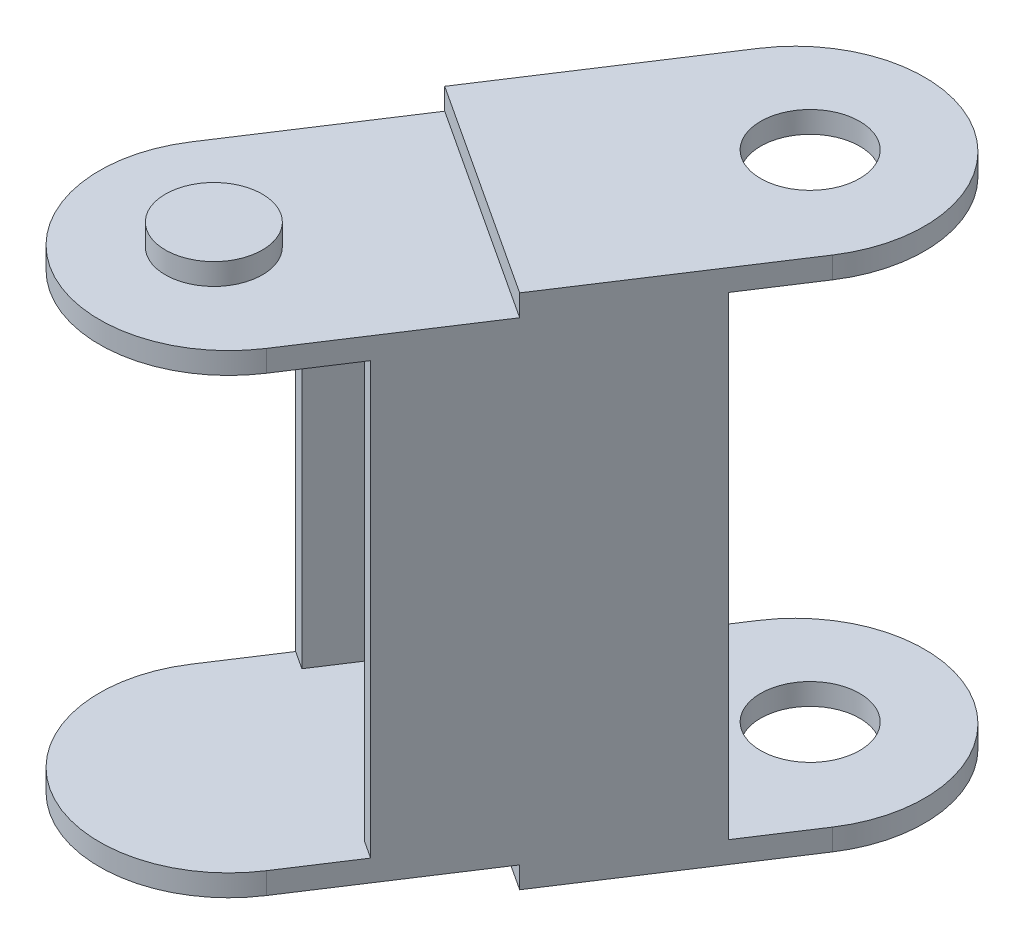
ISO-10303-21;
HEADER;
FILE_DESCRIPTION(('STEP AP214'),'2;1');
FILE_NAME('part.step','',(''),(''),'','','');
FILE_SCHEMA(('AUTOMOTIVE_DESIGN { 1 0 10303 214 1 1 1 1 }'));
ENDSEC;
DATA;
#1=APPLICATION_CONTEXT('core data for automotive mechanical design processes');
#2=APPLICATION_PROTOCOL_DEFINITION('international standard','automotive_design',2000,#1);
#3=PRODUCT_CONTEXT('',#1,'mechanical');
#4=PRODUCT('Part','Part','',(#3));
#5=PRODUCT_RELATED_PRODUCT_CATEGORY('part','',(#4));
#6=PRODUCT_DEFINITION_FORMATION('','',#4);
#7=PRODUCT_DEFINITION_CONTEXT('part definition',#1,'design');
#8=PRODUCT_DEFINITION('design','',#6,#7);
#9=PRODUCT_DEFINITION_SHAPE('','',#8);
#10=(LENGTH_UNIT() NAMED_UNIT(*) SI_UNIT(.MILLI.,.METRE.));
#11=(NAMED_UNIT(*) PLANE_ANGLE_UNIT() SI_UNIT($,.RADIAN.));
#12=(NAMED_UNIT(*) SI_UNIT($,.STERADIAN.) SOLID_ANGLE_UNIT());
#13=UNCERTAINTY_MEASURE_WITH_UNIT(LENGTH_MEASURE(1.E-05),#10,'distance_accuracy_value','');
#14=(GEOMETRIC_REPRESENTATION_CONTEXT(3) GLOBAL_UNCERTAINTY_ASSIGNED_CONTEXT((#13)) GLOBAL_UNIT_ASSIGNED_CONTEXT((#10,
#11,#12)) REPRESENTATION_CONTEXT('',''));
#15=CARTESIAN_POINT('',(0.,0.,0.));
#16=DIRECTION('',(0.,0.,1.));
#17=DIRECTION('',(1.,0.,0.));
#18=AXIS2_PLACEMENT_3D('',#15,#16,#17);
#19=CARTESIAN_POINT('',(-568.4078515014,21.5,26.4838286484));
#20=DIRECTION('',(0.,1.,0.));
#21=DIRECTION('',(-0.547036832011637,0.,0.837108538018023));
#22=AXIS2_PLACEMENT_3D('',#19,#20,#21);
#23=CYLINDRICAL_SURFACE('',#22,2.25);
#24=CARTESIAN_POINT('',(-568.4078515014,21.,26.4838286484));
#25=DIRECTION('',(0.,1.,0.));
#26=DIRECTION('',(-0.547036832011599,0.,0.837108538018048));
#27=AXIS2_PLACEMENT_3D('',#24,#25,#26);
#28=CIRCLE('',#27,2.25);
#29=CARTESIAN_POINT('',(-569.638684373426,21.,28.3673228589406));
#30=VERTEX_POINT('',#29);
#31=EDGE_CURVE('E205',#30,#30,#28,.F.);
#32=ORIENTED_EDGE('',*,*,#31,.F.);
#33=EDGE_LOOP('',(#32));
#34=FACE_BOUND('',#33,.T.);
#35=CARTESIAN_POINT('',(-568.4078515014,22.,26.4838286484));
#36=DIRECTION('',(0.,-1.,0.));
#37=DIRECTION('',(0.54703683201165,0.,-0.837108538018015));
#38=AXIS2_PLACEMENT_3D('',#35,#36,#37);
#39=CIRCLE('',#38,2.25);
#40=CARTESIAN_POINT('',(-567.177018629374,22.,24.6003344378595));
#41=VERTEX_POINT('',#40);
#42=EDGE_CURVE('E202',#41,#41,#39,.F.);
#43=ORIENTED_EDGE('',*,*,#42,.F.);
#44=EDGE_LOOP('',(#43));
#45=FACE_BOUND('',#44,.T.);
#46=ADVANCED_FACE('F17',(#34,#45),#23,.T.);
#47=CARTESIAN_POINT('',(-558.461868785464,21.,22.23207279855));
#48=DIRECTION('',(0.,1.,0.));
#49=DIRECTION('',(-0.837108538017957,0.,-0.547036832011738));
#50=AXIS2_PLACEMENT_3D('',#47,#48,#49);
#51=PLANE('',#50);
#52=CARTESIAN_POINT('',(-568.134333085423,21.,26.065274379253));
#53=DIRECTION('',(0.,1.,0.));
#54=DIRECTION('',(-0.547036831997825,0.,0.837108538027049));
#55=AXIS2_PLACEMENT_3D('',#52,#53,#54);
#56=CIRCLE('',#55,6.);
#57=CARTESIAN_POINT('',(-563.111681857329,21.,29.347495371344));
#58=VERTEX_POINT('',#57);
#59=CARTESIAN_POINT('',(-573.156984313483,21.,22.783053387219));
#60=VERTEX_POINT('',#59);
#61=EDGE_CURVE('E189',#58,#60,#56,.F.);
#62=ORIENTED_EDGE('',*,*,#61,.F.);
#63=DIRECTION('',(0.547036832013872,0.,-0.837108538016563));
#64=VECTOR('',#63,1.);
#65=CARTESIAN_POINT('',(-563.111681857365,21.,29.347495371321));
#66=LINE('',#65,#64);
#67=CARTESIAN_POINT('',(-558.461868785481,21.,22.232072798539));
#68=VERTEX_POINT('',#67);
#69=EDGE_CURVE('E177',#68,#58,#66,.F.);
#70=ORIENTED_EDGE('',*,*,#69,.F.);
#71=DIRECTION('',(-0.83710853801795,0.,-0.547036832011749));
#72=VECTOR('',#71,1.);
#73=CARTESIAN_POINT('',(-558.461868785481,21.,22.232072798539));
#74=LINE('',#73,#72);
#75=CARTESIAN_POINT('',(-568.507171242,21.,15.6676308142));
#76=VERTEX_POINT('',#75);
#77=EDGE_CURVE('E188',#76,#68,#74,.F.);
#78=ORIENTED_EDGE('',*,*,#77,.F.);
#79=DIRECTION('',(-0.547036831968092,0.,0.837108538046479));
#80=VECTOR('',#79,1.);
#81=CARTESIAN_POINT('',(-568.507171242,21.,15.6676308142));
#82=LINE('',#81,#80);
#83=EDGE_CURVE('E201',#60,#76,#82,.F.);
#84=ORIENTED_EDGE('',*,*,#83,.F.);
#85=EDGE_LOOP('',(#62,#70,#78,#84));
#86=FACE_BOUND('',#85,.T.);
#87=ORIENTED_EDGE('',*,*,#31,.T.);
#88=EDGE_LOOP('',(#87));
#89=FACE_BOUND('',#88,.T.);
#90=ADVANCED_FACE('F199',(#86,#89),#51,.T.);
#91=CARTESIAN_POINT('',(-569.110907137406,22.,23.336569711002));
#92=DIRECTION('',(0.,1.,0.));
#93=DIRECTION('',(-0.547036832011739,0.,0.837108538017957));
#94=AXIS2_PLACEMENT_3D('',#91,#92,#93);
#95=PLANE('',#94);
#96=ORIENTED_EDGE('',*,*,#42,.T.);
#97=EDGE_LOOP('',(#96));
#98=FACE_BOUND('',#97,.T.);
#99=ADVANCED_FACE('F629',(#98),#95,.T.);
#100=CARTESIAN_POINT('',(-568.134333085256,-2.,26.065274379362));
#101=DIRECTION('',(0.,1.,0.));
#102=DIRECTION('',(-0.837108538018314,0.,-0.547036832011192));
#103=AXIS2_PLACEMENT_3D('',#100,#101,#102);
#104=CYLINDRICAL_SURFACE('',#103,6.);
#105=DIRECTION('',(-1.1482E-11,-1.,1.7653E-11));
#106=VECTOR('',#105,1.);
#107=CARTESIAN_POINT('',(-573.156984313366,21.,22.783053387295));
#108=LINE('',#107,#106);
#109=CARTESIAN_POINT('',(-573.156984313377,20.,22.783053387312));
#110=VERTEX_POINT('',#109);
#111=EDGE_CURVE('E217',#110,#60,#108,.F.);
#112=ORIENTED_EDGE('',*,*,#111,.F.);
#113=CARTESIAN_POINT('',(-568.134333085256,20.,26.065274379362));
#114=DIRECTION('',(0.,1.,0.));
#115=DIRECTION('',(-0.837108538020234,0.,-0.547036832008254));
#116=AXIS2_PLACEMENT_3D('',#113,#114,#115);
#117=CIRCLE('',#116,6.);
#118=CARTESIAN_POINT('',(-563.11168185732,20.,29.347495371331));
#119=VERTEX_POINT('',#118);
#120=EDGE_CURVE('E196',#110,#119,#117,.T.);
#121=ORIENTED_EDGE('',*,*,#120,.T.);
#122=DIRECTION('',(-8.754E-12,1.,1.3255E-11));
#123=VECTOR('',#122,1.);
#124=CARTESIAN_POINT('',(-563.11168185732,20.,29.347495371331));
#125=LINE('',#124,#123);
#126=EDGE_CURVE('E181',#119,#58,#125,.T.);
#127=ORIENTED_EDGE('',*,*,#126,.T.);
#128=ORIENTED_EDGE('',*,*,#61,.T.);
#129=EDGE_LOOP('',(#112,#121,#127,#128));
#130=FACE_BOUND('',#129,.T.);
#131=ADVANCED_FACE('F195',(#130),#104,.T.);
#132=CARTESIAN_POINT('',(-563.111681857287,-2.,29.347495371461));
#133=DIRECTION('',(0.837108538017957,0.,0.547036832011739));
#134=DIRECTION('',(0.547036832011739,0.,-0.837108538017957));
#135=AXIS2_PLACEMENT_3D('',#132,#133,#134);
#136=PLANE('',#135);
#137=DIRECTION('',(0.,-1.,0.));
#138=VECTOR('',#137,1.);
#139=CARTESIAN_POINT('',(-558.46186878538,22.,22.232072798605));
#140=LINE('',#139,#138);
#141=CARTESIAN_POINT('',(-558.46186878538,22.,22.232072798605));
#142=VERTEX_POINT('',#141);
#143=EDGE_CURVE('E184',#142,#68,#140,.T.);
#144=ORIENTED_EDGE('',*,*,#143,.T.);
#145=ORIENTED_EDGE('',*,*,#69,.T.);
#146=ORIENTED_EDGE('',*,*,#126,.F.);
#147=DIRECTION('',(0.547036832011751,0.,-0.837108538017949));
#148=VECTOR('',#147,1.);
#149=CARTESIAN_POINT('',(-563.111681857237,20.,29.347495371385));
#150=LINE('',#149,#148);
#151=CARTESIAN_POINT('',(-561.197052945412,20.,26.417615488653));
#152=VERTEX_POINT('',#151);
#153=EDGE_CURVE('E229',#119,#152,#150,.T.);
#154=ORIENTED_EDGE('',*,*,#153,.T.);
#155=DIRECTION('',(0.,-1.,0.));
#156=VECTOR('',#155,1.);
#157=CARTESIAN_POINT('',(-561.197052945412,20.,26.417615488653));
#158=LINE('',#157,#156);
#159=CARTESIAN_POINT('',(-561.197052945412,0.,26.417615488653));
#160=VERTEX_POINT('',#159);
#161=EDGE_CURVE('E233',#152,#160,#158,.T.);
#162=ORIENTED_EDGE('',*,*,#161,.T.);
#163=DIRECTION('',(-0.547036832011735,0.,0.837108538017959));
#164=VECTOR('',#163,1.);
#165=CARTESIAN_POINT('',(-561.197052945412,0.,26.417615488653));
#166=LINE('',#165,#164);
#167=CARTESIAN_POINT('',(-563.111681857245,0.,29.347495371399));
#168=VERTEX_POINT('',#167);
#169=EDGE_CURVE('E238',#160,#168,#166,.T.);
#170=ORIENTED_EDGE('',*,*,#169,.T.);
#171=DIRECTION('',(-2.387E-12,-1.,3.67E-12));
#172=VECTOR('',#171,1.);
#173=CARTESIAN_POINT('',(-563.111681857245,0.,29.347495371399));
#174=LINE('',#173,#172);
#175=CARTESIAN_POINT('',(-563.111681857248,-1.,29.347495371402));
#176=VERTEX_POINT('',#175);
#177=EDGE_CURVE('E243',#176,#168,#174,.F.);
#178=ORIENTED_EDGE('',*,*,#177,.F.);
#179=DIRECTION('',(0.547036832011736,0.,-0.837108538017958));
#180=VECTOR('',#179,1.);
#181=CARTESIAN_POINT('',(-563.111681857248,-1.,29.347495371402));
#182=LINE('',#181,#180);
#183=CARTESIAN_POINT('',(-558.46186878538,-1.,22.232072798605));
#184=VERTEX_POINT('',#183);
#185=EDGE_CURVE('E247',#176,#184,#182,.T.);
#186=ORIENTED_EDGE('',*,*,#185,.T.);
#187=DIRECTION('',(0.,-1.,0.));
#188=VECTOR('',#187,1.);
#189=CARTESIAN_POINT('',(-558.46186878538,-1.,22.232072798605));
#190=LINE('',#189,#188);
#191=CARTESIAN_POINT('',(-558.46186878538,-2.,22.232072798605));
#192=VERTEX_POINT('',#191);
#193=EDGE_CURVE('E252',#184,#192,#190,.T.);
#194=ORIENTED_EDGE('',*,*,#193,.T.);
#195=DIRECTION('',(0.547036832011742,0.,-0.837108538017955));
#196=VECTOR('',#195,1.);
#197=CARTESIAN_POINT('',(-558.46186878538,-2.,22.232072798605));
#198=LINE('',#197,#196);
#199=CARTESIAN_POINT('',(-552.717982049063,-2.,13.44243314912));
#200=VERTEX_POINT('',#199);
#201=EDGE_CURVE('E257',#192,#200,#198,.T.);
#202=ORIENTED_EDGE('',*,*,#201,.T.);
#203=DIRECTION('',(-1.14E-13,1.,1.15E-13));
#204=VECTOR('',#203,1.);
#205=CARTESIAN_POINT('',(-552.717982049063,-2.,13.44243314912));
#206=LINE('',#205,#204);
#207=CARTESIAN_POINT('',(-552.717982049063,-1.,13.44243314912));
#208=VERTEX_POINT('',#207);
#209=EDGE_CURVE('E262',#200,#208,#206,.T.);
#210=ORIENTED_EDGE('',*,*,#209,.T.);
#211=DIRECTION('',(-0.547036832011731,0.,0.837108538017962));
#212=VECTOR('',#211,1.);
#213=CARTESIAN_POINT('',(-552.717982049063,-1.,13.44243314912));
#214=LINE('',#213,#212);
#215=CARTESIAN_POINT('',(-554.632610961263,-1.,16.372313032426));
#216=VERTEX_POINT('',#215);
#217=EDGE_CURVE('E267',#208,#216,#214,.T.);
#218=ORIENTED_EDGE('',*,*,#217,.T.);
#219=DIRECTION('',(0.,1.,0.));
#220=VECTOR('',#219,1.);
#221=CARTESIAN_POINT('',(-554.632610961263,-1.,16.372313032426));
#222=LINE('',#221,#220);
#223=CARTESIAN_POINT('',(-554.632610961263,21.,16.372313032426));
#224=VERTEX_POINT('',#223);
#225=EDGE_CURVE('E272',#216,#224,#222,.T.);
#226=ORIENTED_EDGE('',*,*,#225,.T.);
#227=DIRECTION('',(0.54703683201175,0.,-0.83710853801795));
#228=VECTOR('',#227,1.);
#229=CARTESIAN_POINT('',(-554.632610961263,21.,16.372313032426));
#230=LINE('',#229,#228);
#231=CARTESIAN_POINT('',(-552.717982049063,21.,13.44243314912));
#232=VERTEX_POINT('',#231);
#233=EDGE_CURVE('E277',#224,#232,#230,.T.);
#234=ORIENTED_EDGE('',*,*,#233,.T.);
#235=DIRECTION('',(0.,1.,0.));
#236=VECTOR('',#235,1.);
#237=CARTESIAN_POINT('',(-552.717982049063,21.,13.44243314912));
#238=LINE('',#237,#236);
#239=CARTESIAN_POINT('',(-552.717982049063,22.,13.44243314912));
#240=VERTEX_POINT('',#239);
#241=EDGE_CURVE('E282',#232,#240,#238,.T.);
#242=ORIENTED_EDGE('',*,*,#241,.T.);
#243=DIRECTION('',(-0.547036832011743,0.,0.837108538017954));
#244=VECTOR('',#243,1.);
#245=CARTESIAN_POINT('',(-552.717982049063,22.,13.44243314912));
#246=LINE('',#245,#244);
#247=EDGE_CURVE('E287',#240,#142,#246,.T.);
#248=ORIENTED_EDGE('',*,*,#247,.T.);
#249=EDGE_LOOP('',(#144,#145,#146,#154,#162,#170,#178,#186,#194,#202,#210,#218,#226,#234,#242,#248));
#250=FACE_BOUND('',#249,.T.);
#251=ADVANCED_FACE('F179',(#250),#136,.T.);
#252=CARTESIAN_POINT('',(-568.507171242,21.,15.6676308142));
#253=DIRECTION('',(-0.547036832011738,0.,0.837108538017957));
#254=DIRECTION('',(0.837108538017957,0.,0.547036832011738));
#255=AXIS2_PLACEMENT_3D('',#252,#253,#254);
#256=PLANE('',#255);
#257=DIRECTION('',(-0.837108538017957,0.,-0.547036832011739));
#258=VECTOR('',#257,1.);
#259=CARTESIAN_POINT('',(-558.461868785481,22.,22.232072798539));
#260=LINE('',#259,#258);
#261=CARTESIAN_POINT('',(-568.507171241922,22.,15.667630814251));
#262=VERTEX_POINT('',#261);
#263=EDGE_CURVE('E291',#262,#142,#260,.F.);
#264=ORIENTED_EDGE('',*,*,#263,.F.);
#265=DIRECTION('',(-7.8444E-11,-1.,-5.1275E-11));
#266=VECTOR('',#265,1.);
#267=CARTESIAN_POINT('',(-568.507171241922,22.,15.667630814251));
#268=LINE('',#267,#266);
#269=EDGE_CURVE('E295',#76,#262,#268,.F.);
#270=ORIENTED_EDGE('',*,*,#269,.F.);
#271=ORIENTED_EDGE('',*,*,#77,.T.);
#272=ORIENTED_EDGE('',*,*,#143,.F.);
#273=EDGE_LOOP('',(#264,#270,#271,#272));
#274=FACE_BOUND('',#273,.T.);
#275=ADVANCED_FACE('F613',(#274),#256,.T.);
#276=CARTESIAN_POINT('',(-562.763284505279,-2.,6.877991164979));
#277=DIRECTION('',(-0.837108538017957,0.,-0.547036832011739));
#278=DIRECTION('',(-0.547036832011739,0.,0.837108538017957));
#279=AXIS2_PLACEMENT_3D('',#276,#277,#278);
#280=PLANE('',#279);
#281=ORIENTED_EDGE('',*,*,#83,.T.);
#282=ORIENTED_EDGE('',*,*,#269,.T.);
#283=DIRECTION('',(0.547036832011739,0.,-0.837108538017956));
#284=VECTOR('',#283,1.);
#285=CARTESIAN_POINT('',(-568.507171241596,22.,15.667630814464));
#286=LINE('',#285,#284);
#287=CARTESIAN_POINT('',(-562.763284505279,22.,6.877991164979));
#288=VERTEX_POINT('',#287);
#289=EDGE_CURVE('E300',#262,#288,#286,.T.);
#290=ORIENTED_EDGE('',*,*,#289,.T.);
#291=DIRECTION('',(0.,-1.,0.));
#292=VECTOR('',#291,1.);
#293=CARTESIAN_POINT('',(-562.763284505279,22.,6.877991164979));
#294=LINE('',#293,#292);
#295=CARTESIAN_POINT('',(-562.763284505279,21.,6.87799116498));
#296=VERTEX_POINT('',#295);
#297=EDGE_CURVE('E305',#296,#288,#294,.F.);
#298=ORIENTED_EDGE('',*,*,#297,.F.);
#299=DIRECTION('',(-0.547036832011748,0.,0.837108538017951));
#300=VECTOR('',#299,1.);
#301=CARTESIAN_POINT('',(-562.763284505279,21.,6.87799116498));
#302=LINE('',#301,#300);
#303=CARTESIAN_POINT('',(-564.677913417478,21.,9.807871048285));
#304=VERTEX_POINT('',#303);
#305=EDGE_CURVE('E310',#296,#304,#302,.T.);
#306=ORIENTED_EDGE('',*,*,#305,.T.);
#307=DIRECTION('',(0.,-1.,0.));
#308=VECTOR('',#307,1.);
#309=CARTESIAN_POINT('',(-564.677913417478,21.,9.807871048285));
#310=LINE('',#309,#308);
#311=CARTESIAN_POINT('',(-564.677913417478,-1.,9.807871048285));
#312=VERTEX_POINT('',#311);
#313=EDGE_CURVE('E315',#304,#312,#310,.T.);
#314=ORIENTED_EDGE('',*,*,#313,.T.);
#315=DIRECTION('',(0.547036832011748,0.,-0.83710853801795));
#316=VECTOR('',#315,1.);
#317=CARTESIAN_POINT('',(-564.677913417478,-1.,9.807871048285));
#318=LINE('',#317,#316);
#319=CARTESIAN_POINT('',(-562.763284505279,-1.,6.877991164979));
#320=VERTEX_POINT('',#319);
#321=EDGE_CURVE('E320',#312,#320,#318,.T.);
#322=ORIENTED_EDGE('',*,*,#321,.T.);
#323=DIRECTION('',(0.,-1.,0.));
#324=VECTOR('',#323,1.);
#325=CARTESIAN_POINT('',(-562.763284505279,-1.,6.877991164979));
#326=LINE('',#325,#324);
#327=CARTESIAN_POINT('',(-562.763284505279,-2.,6.877991164979));
#328=VERTEX_POINT('',#327);
#329=EDGE_CURVE('E325',#328,#320,#326,.F.);
#330=ORIENTED_EDGE('',*,*,#329,.F.);
#331=DIRECTION('',(-0.547036832011738,0.,0.837108538017957));
#332=VECTOR('',#331,1.);
#333=CARTESIAN_POINT('',(-562.763284505279,-2.,6.877991164979));
#334=LINE('',#333,#332);
#335=CARTESIAN_POINT('',(-568.507171241596,-2.,15.667630814464));
#336=VERTEX_POINT('',#335);
#337=EDGE_CURVE('E330',#328,#336,#334,.T.);
#338=ORIENTED_EDGE('',*,*,#337,.T.);
#339=DIRECTION('',(0.,1.,0.));
#340=VECTOR('',#339,1.);
#341=CARTESIAN_POINT('',(-568.507171241596,-2.,15.667630814464));
#342=LINE('',#341,#340);
#343=CARTESIAN_POINT('',(-568.507171241596,-1.,15.667630814464));
#344=VERTEX_POINT('',#343);
#345=EDGE_CURVE('E335',#336,#344,#342,.T.);
#346=ORIENTED_EDGE('',*,*,#345,.T.);
#347=DIRECTION('',(-0.547036832011739,0.,0.837108538017957));
#348=VECTOR('',#347,1.);
#349=CARTESIAN_POINT('',(-568.507171241596,-1.,15.667630814464));
#350=LINE('',#349,#348);
#351=CARTESIAN_POINT('',(-573.156984313449,-1.,22.78305338724));
#352=VERTEX_POINT('',#351);
#353=EDGE_CURVE('E340',#344,#352,#350,.T.);
#354=ORIENTED_EDGE('',*,*,#353,.T.);
#355=DIRECTION('',(-2.956E-12,1.,4.508E-12));
#356=VECTOR('',#355,1.);
#357=CARTESIAN_POINT('',(-573.156984313449,-1.,22.78305338724));
#358=LINE('',#357,#356);
#359=CARTESIAN_POINT('',(-573.156984313452,0.,22.783053387245));
#360=VERTEX_POINT('',#359);
#361=EDGE_CURVE('E345',#352,#360,#358,.T.);
#362=ORIENTED_EDGE('',*,*,#361,.T.);
#363=DIRECTION('',(0.547036832011729,0.,-0.837108538017963));
#364=VECTOR('',#363,1.);
#365=CARTESIAN_POINT('',(-573.156984313452,0.,22.783053387245));
#366=LINE('',#365,#364);
#367=CARTESIAN_POINT('',(-571.242355401627,0.,19.853173504513));
#368=VERTEX_POINT('',#367);
#369=EDGE_CURVE('E350',#360,#368,#366,.T.);
#370=ORIENTED_EDGE('',*,*,#369,.T.);
#371=DIRECTION('',(0.,1.,0.));
#372=VECTOR('',#371,1.);
#373=CARTESIAN_POINT('',(-571.242355401627,0.,19.853173504513));
#374=LINE('',#373,#372);
#375=CARTESIAN_POINT('',(-571.242355401627,20.,19.853173504513));
#376=VERTEX_POINT('',#375);
#377=EDGE_CURVE('E355',#368,#376,#374,.T.);
#378=ORIENTED_EDGE('',*,*,#377,.T.);
#379=DIRECTION('',(-0.547036832011755,0.,0.837108538017946));
#380=VECTOR('',#379,1.);
#381=CARTESIAN_POINT('',(-571.242355401627,20.,19.853173504513));
#382=LINE('',#381,#380);
#383=EDGE_CURVE('E360',#376,#110,#382,.T.);
#384=ORIENTED_EDGE('',*,*,#383,.T.);
#385=ORIENTED_EDGE('',*,*,#111,.T.);
#386=EDGE_LOOP('',(#281,#282,#290,#298,#306,#314,#322,#330,#338,#346,#354,#362,#370,#378,#384,#385));
#387=FACE_BOUND('',#386,.T.);
#388=ADVANCED_FACE('F555',(#387),#280,.T.);
#389=CARTESIAN_POINT('',(-564.677913417521,20.,9.807871048257));
#390=DIRECTION('',(0.,-1.,0.));
#391=DIRECTION('',(0.837108538017957,0.,0.547036832011739));
#392=AXIS2_PLACEMENT_3D('',#389,#390,#391);
#393=PLANE('',#392);
#394=CARTESIAN_POINT('',(-557.467114861165,20.,9.741657888041));
#395=DIRECTION('',(0.,1.,0.));
#396=DIRECTION('',(-0.547036832011739,0.,0.837108538017956));
#397=AXIS2_PLACEMENT_3D('',#394,#395,#396);
#398=CIRCLE('',#397,6.2);
#399=CARTESIAN_POINT('',(-563.620718759,20.,10.498730585046));
#400=VERTEX_POINT('',#399);
#401=CARTESIAN_POINT('',(-555.689805619741,20.,15.681453495665));
#402=VERTEX_POINT('',#401);
#403=EDGE_CURVE('E365',#400,#402,#398,.T.);
#404=ORIENTED_EDGE('',*,*,#403,.T.);
#405=DIRECTION('',(0.837108538017867,0.,0.547036832011876));
#406=VECTOR('',#405,1.);
#407=CARTESIAN_POINT('',(-555.689805619741,20.,15.681453495665));
#408=LINE('',#407,#406);
#409=CARTESIAN_POINT('',(-555.469719499281,20.,15.825276200414));
#410=VERTEX_POINT('',#409);
#411=EDGE_CURVE('E370',#402,#410,#408,.T.);
#412=ORIENTED_EDGE('',*,*,#411,.T.);
#413=DIRECTION('',(-0.547036832011733,0.,0.837108538017961));
#414=VECTOR('',#413,1.);
#415=CARTESIAN_POINT('',(-555.469719499281,20.,15.825276200414));
#416=LINE('',#415,#414);
#417=CARTESIAN_POINT('',(-562.03416148343,20.,25.870578656642));
#418=VERTEX_POINT('',#417);
#419=EDGE_CURVE('E375',#418,#410,#416,.F.);
#420=ORIENTED_EDGE('',*,*,#419,.F.);
#421=DIRECTION('',(0.837108538017968,0.,0.547036832011721));
#422=VECTOR('',#421,1.);
#423=CARTESIAN_POINT('',(-562.03416148343,20.,25.870578656642));
#424=LINE('',#423,#422);
#425=EDGE_CURVE('E379',#152,#418,#424,.F.);
#426=ORIENTED_EDGE('',*,*,#425,.F.);
#427=ORIENTED_EDGE('',*,*,#153,.F.);
#428=ORIENTED_EDGE('',*,*,#120,.F.);
#429=ORIENTED_EDGE('',*,*,#383,.F.);
#430=DIRECTION('',(0.837108538018042,0.,0.547036832011609));
#431=VECTOR('',#430,1.);
#432=CARTESIAN_POINT('',(-571.24235540167,20.,19.853173504485));
#433=LINE('',#432,#431);
#434=CARTESIAN_POINT('',(-570.405246863609,20.,20.400210336525));
#435=VERTEX_POINT('',#434);
#436=EDGE_CURVE('E384',#435,#376,#433,.F.);
#437=ORIENTED_EDGE('',*,*,#436,.F.);
#438=DIRECTION('',(0.547036832011738,0.,-0.837108538017957));
#439=VECTOR('',#438,1.);
#440=CARTESIAN_POINT('',(-570.405246863609,20.,20.400210336525));
#441=LINE('',#440,#439);
#442=CARTESIAN_POINT('',(-563.84080487946,20.,10.354907880297));
#443=VERTEX_POINT('',#442);
#444=EDGE_CURVE('E388',#443,#435,#441,.F.);
#445=ORIENTED_EDGE('',*,*,#444,.F.);
#446=DIRECTION('',(0.837108538018847,0.,0.547036832010377));
#447=VECTOR('',#446,1.);
#448=CARTESIAN_POINT('',(-563.84080487946,20.,10.354907880297));
#449=LINE('',#448,#447);
#450=EDGE_CURVE('E392',#443,#400,#449,.T.);
#451=ORIENTED_EDGE('',*,*,#450,.T.);
#452=EDGE_LOOP('',(#404,#412,#420,#426,#427,#428,#429,#437,#445,#451));
#453=FACE_BOUND('',#452,.T.);
#454=ADVANCED_FACE('F557',(#453),#393,.T.);
#455=CARTESIAN_POINT('',(-562.03416148343,20.,25.870578656642));
#456=DIRECTION('',(-0.547036832011739,0.,0.837108538017957));
#457=DIRECTION('',(0.,-1.,0.));
#458=AXIS2_PLACEMENT_3D('',#455,#456,#457);
#459=PLANE('',#458);
#460=DIRECTION('',(0.,-1.,0.));
#461=VECTOR('',#460,1.);
#462=CARTESIAN_POINT('',(-562.03416148343,20.,25.870578656642));
#463=LINE('',#462,#461);
#464=CARTESIAN_POINT('',(-562.03416148343,0.,25.870578656642));
#465=VERTEX_POINT('',#464);
#466=EDGE_CURVE('E397',#465,#418,#463,.F.);
#467=ORIENTED_EDGE('',*,*,#466,.F.);
#468=DIRECTION('',(0.837108538017936,0.,0.54703683201177));
#469=VECTOR('',#468,1.);
#470=CARTESIAN_POINT('',(-562.03416148343,0.,25.870578656642));
#471=LINE('',#470,#469);
#472=EDGE_CURVE('E401',#465,#160,#471,.T.);
#473=ORIENTED_EDGE('',*,*,#472,.T.);
#474=ORIENTED_EDGE('',*,*,#161,.F.);
#475=ORIENTED_EDGE('',*,*,#425,.T.);
#476=EDGE_LOOP('',(#467,#473,#474,#475));
#477=FACE_BOUND('',#476,.T.);
#478=ADVANCED_FACE('F563',(#477),#459,.T.);
#479=CARTESIAN_POINT('',(-564.677913417651,0.,9.807871048172));
#480=DIRECTION('',(0.,1.,0.));
#481=DIRECTION('',(-0.547036832011739,0.,0.837108538017957));
#482=AXIS2_PLACEMENT_3D('',#479,#480,#481);
#483=PLANE('',#482);
#484=CARTESIAN_POINT('',(-557.467114861165,0.,9.741657888041));
#485=DIRECTION('',(0.,-1.,0.));
#486=DIRECTION('',(-0.547036832011771,0.,0.837108538017936));
#487=AXIS2_PLACEMENT_3D('',#484,#485,#486);
#488=CIRCLE('',#487,6.2);
#489=CARTESIAN_POINT('',(-555.689805619741,0.,15.681453495665));
#490=VERTEX_POINT('',#489);
#491=CARTESIAN_POINT('',(-563.620718759,0.,10.498730585046));
#492=VERTEX_POINT('',#491);
#493=EDGE_CURVE('E406',#490,#492,#488,.T.);
#494=ORIENTED_EDGE('',*,*,#493,.T.);
#495=DIRECTION('',(-0.837108538018301,0.,-0.547036832011212));
#496=VECTOR('',#495,1.);
#497=CARTESIAN_POINT('',(-563.620718759,0.,10.498730585046));
#498=LINE('',#497,#496);
#499=CARTESIAN_POINT('',(-563.840804879461,0.,10.354907880296));
#500=VERTEX_POINT('',#499);
#501=EDGE_CURVE('E411',#492,#500,#498,.T.);
#502=ORIENTED_EDGE('',*,*,#501,.T.);
#503=DIRECTION('',(-0.547036832011709,0.,0.837108538017976));
#504=VECTOR('',#503,1.);
#505=CARTESIAN_POINT('',(-563.840804879461,0.,10.354907880296));
#506=LINE('',#505,#504);
#507=CARTESIAN_POINT('',(-570.405246863609,0.,20.400210336524));
#508=VERTEX_POINT('',#507);
#509=EDGE_CURVE('E416',#508,#500,#506,.F.);
#510=ORIENTED_EDGE('',*,*,#509,.F.);
#511=DIRECTION('',(-0.837108538017975,0.,-0.54703683201171));
#512=VECTOR('',#511,1.);
#513=CARTESIAN_POINT('',(-570.405246863609,0.,20.400210336524));
#514=LINE('',#513,#512);
#515=EDGE_CURVE('E420',#368,#508,#514,.F.);
#516=ORIENTED_EDGE('',*,*,#515,.F.);
#517=ORIENTED_EDGE('',*,*,#369,.F.);
#518=CARTESIAN_POINT('',(-568.134333085423,0.,26.065274379253));
#519=DIRECTION('',(0.,1.,0.));
#520=DIRECTION('',(-0.547036831997821,0.,0.837108538027052));
#521=AXIS2_PLACEMENT_3D('',#518,#519,#520);
#522=CIRCLE('',#521,6.);
#523=EDGE_CURVE('E425',#168,#360,#522,.F.);
#524=ORIENTED_EDGE('',*,*,#523,.F.);
#525=ORIENTED_EDGE('',*,*,#169,.F.);
#526=ORIENTED_EDGE('',*,*,#472,.F.);
#527=DIRECTION('',(0.547036832011738,0.,-0.837108538017957));
#528=VECTOR('',#527,1.);
#529=CARTESIAN_POINT('',(-562.03416148343,0.,25.870578656642));
#530=LINE('',#529,#528);
#531=CARTESIAN_POINT('',(-555.469719499281,0.,15.825276200414));
#532=VERTEX_POINT('',#531);
#533=EDGE_CURVE('E429',#532,#465,#530,.F.);
#534=ORIENTED_EDGE('',*,*,#533,.F.);
#535=DIRECTION('',(-0.837108538018065,0.,-0.547036832011573));
#536=VECTOR('',#535,1.);
#537=CARTESIAN_POINT('',(-555.469719499281,0.,15.825276200414));
#538=LINE('',#537,#536);
#539=EDGE_CURVE('E433',#532,#490,#538,.T.);
#540=ORIENTED_EDGE('',*,*,#539,.T.);
#541=EDGE_LOOP('',(#494,#502,#510,#516,#517,#524,#525,#526,#534,#540));
#542=FACE_BOUND('',#541,.T.);
#543=ADVANCED_FACE('F549',(#542),#483,.T.);
#544=CARTESIAN_POINT('',(-568.134333085423,-2.,26.065274379253));
#545=DIRECTION('',(0.,1.,0.));
#546=DIRECTION('',(-0.54703683199782,0.,0.837108538027053));
#547=AXIS2_PLACEMENT_3D('',#544,#545,#546);
#548=CYLINDRICAL_SURFACE('',#547,6.);
#549=ORIENTED_EDGE('',*,*,#177,.T.);
#550=ORIENTED_EDGE('',*,*,#523,.T.);
#551=ORIENTED_EDGE('',*,*,#361,.F.);
#552=CARTESIAN_POINT('',(-568.134333085256,-1.,26.065274379362));
#553=DIRECTION('',(0.,-1.,0.));
#554=DIRECTION('',(-0.547036832025675,0.,0.83710853800885));
#555=AXIS2_PLACEMENT_3D('',#552,#553,#554);
#556=CIRCLE('',#555,6.);
#557=EDGE_CURVE('E438',#352,#176,#556,.F.);
#558=ORIENTED_EDGE('',*,*,#557,.T.);
#559=EDGE_LOOP('',(#549,#550,#551,#558));
#560=FACE_BOUND('',#559,.T.);
#561=ADVANCED_FACE('F570',(#560),#548,.T.);
#562=CARTESIAN_POINT('',(-568.507171241697,-1.,15.667630814398));
#563=DIRECTION('',(0.,-1.,0.));
#564=DIRECTION('',(0.837108538017957,0.,0.547036832011738));
#565=AXIS2_PLACEMENT_3D('',#562,#563,#564);
#566=PLANE('',#565);
#567=ORIENTED_EDGE('',*,*,#557,.F.);
#568=ORIENTED_EDGE('',*,*,#353,.F.);
#569=DIRECTION('',(0.837108538017954,0.,0.547036832011742));
#570=VECTOR('',#569,1.);
#571=CARTESIAN_POINT('',(-568.507171241697,-1.,15.667630814398));
#572=LINE('',#571,#570);
#573=EDGE_CURVE('E443',#344,#184,#572,.T.);
#574=ORIENTED_EDGE('',*,*,#573,.T.);
#575=ORIENTED_EDGE('',*,*,#185,.F.);
#576=EDGE_LOOP('',(#567,#568,#574,#575));
#577=FACE_BOUND('',#576,.T.);
#578=CARTESIAN_POINT('',(-568.4078515014,-1.,26.4838286484));
#579=DIRECTION('',(0.,1.,0.));
#580=DIRECTION('',(-0.547036832011602,0.,0.837108538018046));
#581=AXIS2_PLACEMENT_3D('',#578,#579,#580);
#582=CIRCLE('',#581,2.25);
#583=CARTESIAN_POINT('',(-569.638684373426,-1.,28.3673228589406));
#584=VERTEX_POINT('',#583);
#585=EDGE_CURVE('E448',#584,#584,#582,.T.);
#586=ORIENTED_EDGE('',*,*,#585,.T.);
#587=EDGE_LOOP('',(#586));
#588=FACE_BOUND('',#587,.T.);
#589=ADVANCED_FACE('F574',(#577,#588),#566,.T.);
#590=CARTESIAN_POINT('',(-568.507171241758,-2.,15.667630814358));
#591=DIRECTION('',(-0.547036832011738,0.,0.837108538017957));
#592=DIRECTION('',(0.837108538017957,0.,0.547036832011738));
#593=AXIS2_PLACEMENT_3D('',#590,#591,#592);
#594=PLANE('',#593);
#595=ORIENTED_EDGE('',*,*,#573,.F.);
#596=ORIENTED_EDGE('',*,*,#345,.F.);
#597=DIRECTION('',(0.837108538017956,0.,0.547036832011739));
#598=VECTOR('',#597,1.);
#599=CARTESIAN_POINT('',(-568.507171241758,-2.,15.667630814358));
#600=LINE('',#599,#598);
#601=EDGE_CURVE('E453',#192,#336,#600,.F.);
#602=ORIENTED_EDGE('',*,*,#601,.F.);
#603=ORIENTED_EDGE('',*,*,#193,.F.);
#604=EDGE_LOOP('',(#595,#596,#602,#603));
#605=FACE_BOUND('',#604,.T.);
#606=ADVANCED_FACE('F578',(#605),#594,.T.);
#607=CARTESIAN_POINT('',(-559.481063513667,-2.,1.855339936691));
#608=DIRECTION('',(0.,-1.,0.));
#609=DIRECTION('',(0.837108538017957,0.,0.547036832011739));
#610=AXIS2_PLACEMENT_3D('',#607,#608,#609);
#611=PLANE('',#610);
#612=ORIENTED_EDGE('',*,*,#601,.T.);
#613=ORIENTED_EDGE('',*,*,#337,.F.);
#614=CARTESIAN_POINT('',(-557.74063327731,-2.,10.160212157079));
#615=DIRECTION('',(0.,-1.,0.));
#616=DIRECTION('',(0.547036832025805,0.,-0.837108538008764));
#617=AXIS2_PLACEMENT_3D('',#614,#615,#616);
#618=CIRCLE('',#617,6.);
#619=EDGE_CURVE('E455',#200,#328,#618,.F.);
#620=ORIENTED_EDGE('',*,*,#619,.F.);
#621=ORIENTED_EDGE('',*,*,#201,.F.);
#622=EDGE_LOOP('',(#612,#613,#620,#621));
#623=FACE_BOUND('',#622,.T.);
#624=CARTESIAN_POINT('',(-557.4671148621,-2.,9.7416578874));
#625=DIRECTION('',(0.,1.,0.));
#626=DIRECTION('',(-0.547036832011774,0.,0.837108538017934));
#627=AXIS2_PLACEMENT_3D('',#624,#625,#626);
#628=CIRCLE('',#627,2.3);
#629=CARTESIAN_POINT('',(-558.725299575727,-2.,11.6670075248413));
#630=VERTEX_POINT('',#629);
#631=EDGE_CURVE('E459',#630,#630,#628,.T.);
#632=ORIENTED_EDGE('',*,*,#631,.T.);
#633=EDGE_LOOP('',(#632));
#634=FACE_BOUND('',#633,.T.);
#635=ADVANCED_FACE('F581',(#623,#634),#611,.T.);
#636=CARTESIAN_POINT('',(-557.74063327731,-2.,10.160212157079));
#637=DIRECTION('',(0.,1.,0.));
#638=DIRECTION('',(0.837108538027114,0.,0.547036831997726));
#639=AXIS2_PLACEMENT_3D('',#636,#637,#638);
#640=CYLINDRICAL_SURFACE('',#639,6.);
#641=ORIENTED_EDGE('',*,*,#209,.F.);
#642=ORIENTED_EDGE('',*,*,#619,.T.);
#643=ORIENTED_EDGE('',*,*,#329,.T.);
#644=CARTESIAN_POINT('',(-557.740633277142,-1.,10.160212157188));
#645=DIRECTION('',(0.,1.,0.));
#646=DIRECTION('',(0.54703683199783,0.,-0.837108538027046));
#647=AXIS2_PLACEMENT_3D('',#644,#645,#646);
#648=CIRCLE('',#647,6.);
#649=EDGE_CURVE('E464',#320,#208,#648,.F.);
#650=ORIENTED_EDGE('',*,*,#649,.T.);
#651=EDGE_LOOP('',(#641,#642,#643,#650));
#652=FACE_BOUND('',#651,.T.);
#653=ADVANCED_FACE('F587',(#652),#640,.T.);
#654=CARTESIAN_POINT('',(-559.481063513809,-1.,1.855339936599));
#655=DIRECTION('',(0.,1.,0.));
#656=DIRECTION('',(-0.547036832011738,0.,0.837108538017957));
#657=AXIS2_PLACEMENT_3D('',#654,#655,#656);
#658=PLANE('',#657);
#659=ORIENTED_EDGE('',*,*,#217,.F.);
#660=ORIENTED_EDGE('',*,*,#649,.F.);
#661=ORIENTED_EDGE('',*,*,#321,.F.);
#662=DIRECTION('',(0.837108538018085,0.,0.547036832011542));
#663=VECTOR('',#662,1.);
#664=CARTESIAN_POINT('',(-564.677913418025,-1.,9.807871047928));
#665=LINE('',#664,#663);
#666=CARTESIAN_POINT('',(-563.620718759,-1.,10.498730585046));
#667=VERTEX_POINT('',#666);
#668=EDGE_CURVE('E467',#667,#312,#665,.F.);
#669=ORIENTED_EDGE('',*,*,#668,.F.);
#670=CARTESIAN_POINT('',(-557.467114861165,-1.,9.741657888041));
#671=DIRECTION('',(0.,1.,0.));
#672=DIRECTION('',(-0.547036832011754,0.,0.837108538017947));
#673=AXIS2_PLACEMENT_3D('',#670,#671,#672);
#674=CIRCLE('',#673,6.2);
#675=CARTESIAN_POINT('',(-555.689805619741,-1.,15.681453495665));
#676=VERTEX_POINT('',#675);
#677=EDGE_CURVE('E471',#676,#667,#674,.F.);
#678=ORIENTED_EDGE('',*,*,#677,.F.);
#679=DIRECTION('',(0.837108538017957,0.,0.547036832011739));
#680=VECTOR('',#679,1.);
#681=CARTESIAN_POINT('',(-555.689805619741,-1.,15.681453495665));
#682=LINE('',#681,#680);
#683=EDGE_CURVE('E475',#216,#676,#682,.F.);
#684=ORIENTED_EDGE('',*,*,#683,.F.);
#685=EDGE_LOOP('',(#659,#660,#661,#669,#678,#684));
#686=FACE_BOUND('',#685,.T.);
#687=CARTESIAN_POINT('',(-557.4671148621,-1.,9.7416578874));
#688=DIRECTION('',(0.,-1.,0.));
#689=DIRECTION('',(0.547036832011729,0.,-0.837108538017963));
#690=AXIS2_PLACEMENT_3D('',#687,#688,#689);
#691=CIRCLE('',#690,2.3);
#692=CARTESIAN_POINT('',(-556.208930148473,-1.,7.81630824995869));
#693=VERTEX_POINT('',#692);
#694=EDGE_CURVE('E480',#693,#693,#691,.T.);
#695=ORIENTED_EDGE('',*,*,#694,.T.);
#696=EDGE_LOOP('',(#695));
#697=FACE_BOUND('',#696,.T.);
#698=ADVANCED_FACE('F590',(#686,#697),#658,.T.);
#699=CARTESIAN_POINT('',(-555.689805619741,-1.,15.681453495665));
#700=DIRECTION('',(0.547036832011738,0.,-0.837108538017957));
#701=DIRECTION('',(0.,1.,0.));
#702=AXIS2_PLACEMENT_3D('',#699,#700,#701);
#703=PLANE('',#702);
#704=DIRECTION('',(0.,1.,0.));
#705=VECTOR('',#704,1.);
#706=CARTESIAN_POINT('',(-555.689805619741,20.,15.681453495665));
#707=LINE('',#706,#705);
#708=CARTESIAN_POINT('',(-555.689805619741,21.,15.681453495665));
#709=VERTEX_POINT('',#708);
#710=EDGE_CURVE('E485',#402,#709,#707,.T.);
#711=ORIENTED_EDGE('',*,*,#710,.T.);
#712=DIRECTION('',(0.837108538017971,0.,0.547036832011716));
#713=VECTOR('',#712,1.);
#714=CARTESIAN_POINT('',(-555.689805619741,21.,15.681453495665));
#715=LINE('',#714,#713);
#716=EDGE_CURVE('E487',#709,#224,#715,.T.);
#717=ORIENTED_EDGE('',*,*,#716,.T.);
#718=ORIENTED_EDGE('',*,*,#225,.F.);
#719=ORIENTED_EDGE('',*,*,#683,.T.);
#720=DIRECTION('',(0.,1.,0.));
#721=VECTOR('',#720,1.);
#722=CARTESIAN_POINT('',(-555.689805619741,-1.,15.681453495665));
#723=LINE('',#722,#721);
#724=EDGE_CURVE('E492',#676,#490,#723,.T.);
#725=ORIENTED_EDGE('',*,*,#724,.T.);
#726=ORIENTED_EDGE('',*,*,#539,.F.);
#727=DIRECTION('',(0.,1.,0.));
#728=VECTOR('',#727,1.);
#729=CARTESIAN_POINT('',(-555.469719499281,0.,15.825276200414));
#730=LINE('',#729,#728);
#731=EDGE_CURVE('E497',#410,#532,#730,.F.);
#732=ORIENTED_EDGE('',*,*,#731,.F.);
#733=ORIENTED_EDGE('',*,*,#411,.F.);
#734=EDGE_LOOP('',(#711,#717,#718,#719,#725,#726,#732,#733));
#735=FACE_BOUND('',#734,.T.);
#736=ADVANCED_FACE('F595',(#735),#703,.T.);
#737=CARTESIAN_POINT('',(-559.481063514902,21.,1.855339935884));
#738=DIRECTION('',(0.,-1.,0.));
#739=DIRECTION('',(0.837108538017957,0.,0.547036832011738));
#740=AXIS2_PLACEMENT_3D('',#737,#738,#739);
#741=PLANE('',#740);
#742=ORIENTED_EDGE('',*,*,#305,.F.);
#743=CARTESIAN_POINT('',(-557.74063327731,21.,10.160212157079));
#744=DIRECTION('',(0.,-1.,0.));
#745=DIRECTION('',(0.547036832025787,0.,-0.837108538008776));
#746=AXIS2_PLACEMENT_3D('',#743,#744,#745);
#747=CIRCLE('',#746,6.);
#748=EDGE_CURVE('E501',#232,#296,#747,.F.);
#749=ORIENTED_EDGE('',*,*,#748,.F.);
#750=ORIENTED_EDGE('',*,*,#233,.F.);
#751=ORIENTED_EDGE('',*,*,#716,.F.);
#752=CARTESIAN_POINT('',(-557.467114861165,21.,9.741657888041));
#753=DIRECTION('',(0.,-1.,0.));
#754=DIRECTION('',(-0.547036832011771,0.,0.837108538017936));
#755=AXIS2_PLACEMENT_3D('',#752,#753,#754);
#756=CIRCLE('',#755,6.2);
#757=CARTESIAN_POINT('',(-563.620718759,21.,10.498730585046));
#758=VERTEX_POINT('',#757);
#759=EDGE_CURVE('E36',#758,#709,#756,.F.);
#760=ORIENTED_EDGE('',*,*,#759,.F.);
#761=DIRECTION('',(-0.837108538017988,0.,-0.547036832011691));
#762=VECTOR('',#761,1.);
#763=CARTESIAN_POINT('',(-563.620718759,21.,10.498730585046));
#764=LINE('',#763,#762);
#765=EDGE_CURVE('E508',#304,#758,#764,.F.);
#766=ORIENTED_EDGE('',*,*,#765,.F.);
#767=EDGE_LOOP('',(#742,#749,#750,#751,#760,#766));
#768=FACE_BOUND('',#767,.T.);
#769=CARTESIAN_POINT('',(-557.4671148621,21.,9.7416578874));
#770=DIRECTION('',(0.,1.,0.));
#771=DIRECTION('',(0.547036832011729,0.,-0.837108538017963));
#772=AXIS2_PLACEMENT_3D('',#769,#770,#771);
#773=CIRCLE('',#772,2.3);
#774=CARTESIAN_POINT('',(-556.208930148473,21.,7.81630824995869));
#775=VERTEX_POINT('',#774);
#776=EDGE_CURVE('E513',#775,#775,#773,.T.);
#777=ORIENTED_EDGE('',*,*,#776,.T.);
#778=EDGE_LOOP('',(#777));
#779=FACE_BOUND('',#778,.T.);
#780=ADVANCED_FACE('F600',(#768,#779),#741,.T.);
#781=CARTESIAN_POINT('',(-557.74063327731,-2.,10.160212157079));
#782=DIRECTION('',(0.,1.,0.));
#783=DIRECTION('',(0.837108538027118,0.,0.54703683199772));
#784=AXIS2_PLACEMENT_3D('',#781,#782,#783);
#785=CYLINDRICAL_SURFACE('',#784,6.);
#786=ORIENTED_EDGE('',*,*,#748,.T.);
#787=ORIENTED_EDGE('',*,*,#297,.T.);
#788=CARTESIAN_POINT('',(-557.740633277142,22.,10.160212157188));
#789=DIRECTION('',(0.,1.,0.));
#790=DIRECTION('',(0.547036831997829,0.,-0.837108538027046));
#791=AXIS2_PLACEMENT_3D('',#788,#789,#790);
#792=CIRCLE('',#791,6.);
#793=EDGE_CURVE('E518',#288,#240,#792,.F.);
#794=ORIENTED_EDGE('',*,*,#793,.T.);
#795=ORIENTED_EDGE('',*,*,#241,.F.);
#796=EDGE_LOOP('',(#786,#787,#794,#795));
#797=FACE_BOUND('',#796,.T.);
#798=ADVANCED_FACE('F605',(#797),#785,.T.);
#799=CARTESIAN_POINT('',(-559.481063513667,22.,1.855339936691));
#800=DIRECTION('',(0.,1.,0.));
#801=DIRECTION('',(-0.547036832011739,0.,0.837108538017957));
#802=AXIS2_PLACEMENT_3D('',#799,#800,#801);
#803=PLANE('',#802);
#804=ORIENTED_EDGE('',*,*,#263,.T.);
#805=ORIENTED_EDGE('',*,*,#247,.F.);
#806=ORIENTED_EDGE('',*,*,#793,.F.);
#807=ORIENTED_EDGE('',*,*,#289,.F.);
#808=EDGE_LOOP('',(#804,#805,#806,#807));
#809=FACE_BOUND('',#808,.T.);
#810=CARTESIAN_POINT('',(-557.4671148621,22.,9.7416578874));
#811=DIRECTION('',(0.,-1.,0.));
#812=DIRECTION('',(-0.547036832011774,0.,0.837108538017933));
#813=AXIS2_PLACEMENT_3D('',#810,#811,#812);
#814=CIRCLE('',#813,2.3);
#815=CARTESIAN_POINT('',(-558.725299575727,22.,11.6670075248412));
#816=VERTEX_POINT('',#815);
#817=EDGE_CURVE('E521',#816,#816,#814,.T.);
#818=ORIENTED_EDGE('',*,*,#817,.T.);
#819=EDGE_LOOP('',(#818));
#820=FACE_BOUND('',#819,.T.);
#821=ADVANCED_FACE('F608',(#809,#820),#803,.T.);
#822=CARTESIAN_POINT('',(-564.677913419118,-1.,9.807871047213));
#823=DIRECTION('',(0.547036832011738,0.,-0.837108538017957));
#824=DIRECTION('',(0.,1.,0.));
#825=AXIS2_PLACEMENT_3D('',#822,#823,#824);
#826=PLANE('',#825);
#827=DIRECTION('',(0.,-1.,0.));
#828=VECTOR('',#827,1.);
#829=CARTESIAN_POINT('',(-563.620718759,21.,10.498730585046));
#830=LINE('',#829,#828);
#831=EDGE_CURVE('E32',#758,#400,#830,.T.);
#832=ORIENTED_EDGE('',*,*,#831,.T.);
#833=ORIENTED_EDGE('',*,*,#450,.F.);
#834=DIRECTION('',(0.,-1.,0.));
#835=VECTOR('',#834,1.);
#836=CARTESIAN_POINT('',(-563.84080487946,20.,10.354907880297));
#837=LINE('',#836,#835);
#838=EDGE_CURVE('E527',#500,#443,#837,.F.);
#839=ORIENTED_EDGE('',*,*,#838,.F.);
#840=ORIENTED_EDGE('',*,*,#501,.F.);
#841=DIRECTION('',(0.,-1.,0.));
#842=VECTOR('',#841,1.);
#843=CARTESIAN_POINT('',(-563.620718759,0.,10.498730585046));
#844=LINE('',#843,#842);
#845=EDGE_CURVE('E531',#492,#667,#844,.T.);
#846=ORIENTED_EDGE('',*,*,#845,.T.);
#847=ORIENTED_EDGE('',*,*,#668,.T.);
#848=ORIENTED_EDGE('',*,*,#313,.F.);
#849=ORIENTED_EDGE('',*,*,#765,.T.);
#850=EDGE_LOOP('',(#832,#833,#839,#840,#846,#847,#848,#849));
#851=FACE_BOUND('',#850,.T.);
#852=ADVANCED_FACE('F781',(#851),#826,.T.);
#853=CARTESIAN_POINT('',(-571.2423554018,20.,19.8531735044));
#854=DIRECTION('',(-0.547036832011739,0.,0.837108538017957));
#855=DIRECTION('',(0.,-1.,0.));
#856=AXIS2_PLACEMENT_3D('',#853,#854,#855);
#857=PLANE('',#856);
#858=DIRECTION('',(0.,1.,0.));
#859=VECTOR('',#858,1.);
#860=CARTESIAN_POINT('',(-570.405246863609,0.,20.400210336524));
#861=LINE('',#860,#859);
#862=EDGE_CURVE('E25',#435,#508,#861,.F.);
#863=ORIENTED_EDGE('',*,*,#862,.F.);
#864=ORIENTED_EDGE('',*,*,#436,.T.);
#865=ORIENTED_EDGE('',*,*,#377,.F.);
#866=ORIENTED_EDGE('',*,*,#515,.T.);
#867=EDGE_LOOP('',(#863,#864,#865,#866));
#868=FACE_BOUND('',#867,.T.);
#869=ADVANCED_FACE('F552',(#868),#857,.T.);
#870=CARTESIAN_POINT('',(-557.467114861165,20.5,9.741657888041));
#871=DIRECTION('',(0.,1.,0.));
#872=DIRECTION('',(-0.992516757715321,0.,0.122108499516891));
#873=AXIS2_PLACEMENT_3D('',#870,#871,#872);
#874=CYLINDRICAL_SURFACE('',#873,6.2);
#875=ORIENTED_EDGE('',*,*,#831,.F.);
#876=ORIENTED_EDGE('',*,*,#759,.T.);
#877=ORIENTED_EDGE('',*,*,#710,.F.);
#878=ORIENTED_EDGE('',*,*,#403,.F.);
#879=EDGE_LOOP('',(#875,#876,#877,#878));
#880=FACE_BOUND('',#879,.T.);
#881=ADVANCED_FACE('F801',(#880),#874,.F.);
#882=CARTESIAN_POINT('',(-555.469719499281,20.,15.825276200414));
#883=DIRECTION('',(-0.837108538017957,0.,-0.547036832011739));
#884=DIRECTION('',(0.,-1.,0.));
#885=AXIS2_PLACEMENT_3D('',#882,#883,#884);
#886=PLANE('',#885);
#887=ORIENTED_EDGE('',*,*,#731,.T.);
#888=ORIENTED_EDGE('',*,*,#533,.T.);
#889=ORIENTED_EDGE('',*,*,#466,.T.);
#890=ORIENTED_EDGE('',*,*,#419,.T.);
#891=EDGE_LOOP('',(#887,#888,#889,#890));
#892=FACE_BOUND('',#891,.T.);
#893=ADVANCED_FACE('F811',(#892),#886,.T.);
#894=CARTESIAN_POINT('',(-563.84080487946,0.,10.354907880297));
#895=DIRECTION('',(0.837108538017957,0.,0.547036832011739));
#896=DIRECTION('',(0.,1.,0.));
#897=AXIS2_PLACEMENT_3D('',#894,#895,#896);
#898=PLANE('',#897);
#899=ORIENTED_EDGE('',*,*,#838,.T.);
#900=ORIENTED_EDGE('',*,*,#444,.T.);
#901=ORIENTED_EDGE('',*,*,#862,.T.);
#902=ORIENTED_EDGE('',*,*,#509,.T.);
#903=EDGE_LOOP('',(#899,#900,#901,#902));
#904=FACE_BOUND('',#903,.T.);
#905=ADVANCED_FACE('F542',(#904),#898,.T.);
#906=CARTESIAN_POINT('',(-557.467114861165,-0.5,9.741657888041));
#907=DIRECTION('',(0.,1.,0.));
#908=DIRECTION('',(-0.547036832011769,0.,0.837108538017937));
#909=AXIS2_PLACEMENT_3D('',#906,#907,#908);
#910=CYLINDRICAL_SURFACE('',#909,6.2);
#911=ORIENTED_EDGE('',*,*,#724,.F.);
#912=ORIENTED_EDGE('',*,*,#677,.T.);
#913=ORIENTED_EDGE('',*,*,#845,.F.);
#914=ORIENTED_EDGE('',*,*,#493,.F.);
#915=EDGE_LOOP('',(#911,#912,#913,#914));
#916=FACE_BOUND('',#915,.T.);
#917=ADVANCED_FACE('F831',(#916),#910,.F.);
#918=CARTESIAN_POINT('',(-568.4078515014,-1.5,26.4838286484));
#919=DIRECTION('',(0.,1.,0.));
#920=DIRECTION('',(-0.54703683201161,0.,0.837108538018041));
#921=AXIS2_PLACEMENT_3D('',#918,#919,#920);
#922=CYLINDRICAL_SURFACE('',#921,2.25);
#923=CARTESIAN_POINT('',(-568.4078515014,-2.,26.4838286484));
#924=DIRECTION('',(0.,1.,0.));
#925=DIRECTION('',(-0.547036832011599,0.,0.837108538018048));
#926=AXIS2_PLACEMENT_3D('',#923,#924,#925);
#927=CIRCLE('',#926,2.25);
#928=CARTESIAN_POINT('',(-569.638684373426,-2.,28.3673228589406));
#929=VERTEX_POINT('',#928);
#930=EDGE_CURVE('E11',#929,#929,#927,.F.);
#931=ORIENTED_EDGE('',*,*,#930,.F.);
#932=EDGE_LOOP('',(#931));
#933=FACE_BOUND('',#932,.T.);
#934=ORIENTED_EDGE('',*,*,#585,.F.);
#935=EDGE_LOOP('',(#934));
#936=FACE_BOUND('',#935,.T.);
#937=ADVANCED_FACE('F841',(#933,#936),#922,.T.);
#938=CARTESIAN_POINT('',(-557.4671148621,10.,9.7416578874));
#939=DIRECTION('',(0.,1.,0.));
#940=DIRECTION('',(-0.547036832011781,0.,0.837108538017929));
#941=AXIS2_PLACEMENT_3D('',#938,#939,#940);
#942=CYLINDRICAL_SURFACE('',#941,2.3);
#943=ORIENTED_EDGE('',*,*,#694,.F.);
#944=EDGE_LOOP('',(#943));
#945=FACE_BOUND('',#944,.T.);
#946=ORIENTED_EDGE('',*,*,#631,.F.);
#947=EDGE_LOOP('',(#946));
#948=FACE_BOUND('',#947,.T.);
#949=ADVANCED_FACE('F852',(#945,#948),#942,.F.);
#950=CARTESIAN_POINT('',(-557.4671148621,10.,9.7416578874));
#951=DIRECTION('',(0.,1.,0.));
#952=DIRECTION('',(0.547036832011732,0.,-0.837108538017962));
#953=AXIS2_PLACEMENT_3D('',#950,#951,#952);
#954=CYLINDRICAL_SURFACE('',#953,2.3);
#955=ORIENTED_EDGE('',*,*,#776,.F.);
#956=EDGE_LOOP('',(#955));
#957=FACE_BOUND('',#956,.T.);
#958=ORIENTED_EDGE('',*,*,#817,.F.);
#959=EDGE_LOOP('',(#958));
#960=FACE_BOUND('',#959,.T.);
#961=ADVANCED_FACE('F863',(#957,#960),#954,.F.);
#962=CARTESIAN_POINT('',(-571.572572881459,-2.,27.103558132083));
#963=DIRECTION('',(0.,-1.,0.));
#964=DIRECTION('',(0.547036832011739,0.,-0.837108538017957));
#965=AXIS2_PLACEMENT_3D('',#962,#963,#964);
#966=PLANE('',#965);
#967=ORIENTED_EDGE('',*,*,#930,.T.);
#968=EDGE_LOOP('',(#967));
#969=FACE_BOUND('',#968,.T.);
#970=ADVANCED_FACE('F19',(#969),#966,.T.);
#971=CLOSED_SHELL('',(#46,#90,#99,#131,#251,#275,#388,#454,#478,#543,#561,#589,#606,#635,#653,
#698,#736,#780,#798,#821,#852,#869,#881,#893,#905,#917,#937,#949,#961,#970));
#972=MANIFOLD_SOLID_BREP('B1',#971);
#973=ADVANCED_BREP_SHAPE_REPRESENTATION('',(#18,#972),#14);
#974=SHAPE_DEFINITION_REPRESENTATION(#9,#973);
ENDSEC;
END-ISO-10303-21;
